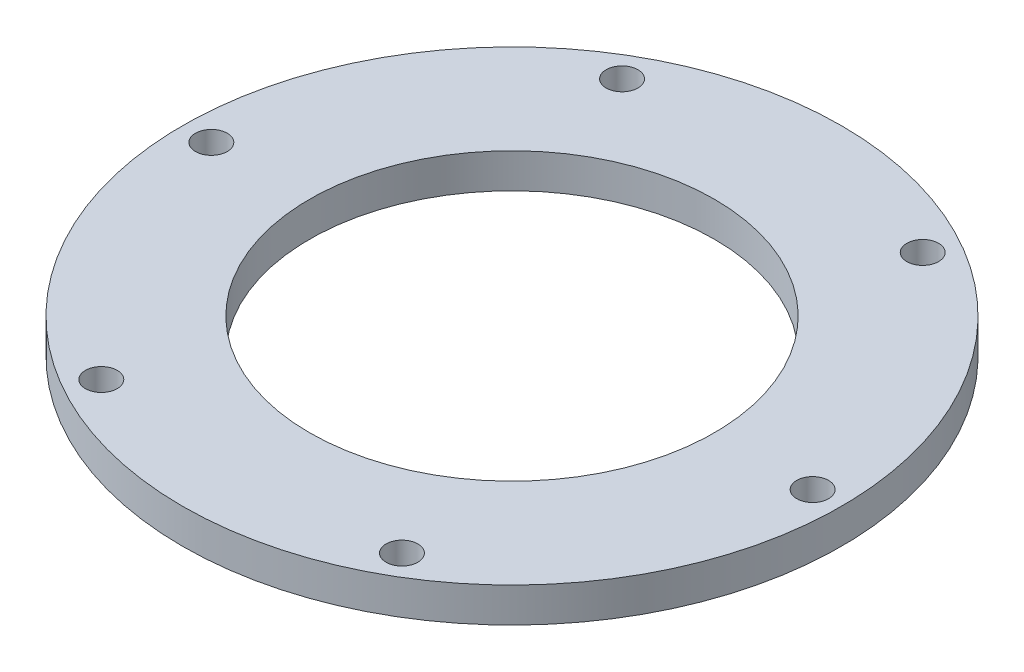
ISO-10303-21;
HEADER;
FILE_DESCRIPTION(('STEP AP214'),'2;1');
FILE_NAME('part.step','',(''),(''),'','','');
FILE_SCHEMA(('AUTOMOTIVE_DESIGN { 1 0 10303 214 1 1 1 1 }'));
ENDSEC;
DATA;
#1=APPLICATION_CONTEXT('core data for automotive mechanical design processes');
#2=APPLICATION_PROTOCOL_DEFINITION('international standard','automotive_design',2000,#1);
#3=PRODUCT_CONTEXT('',#1,'mechanical');
#4=PRODUCT('Part','Part','',(#3));
#5=PRODUCT_RELATED_PRODUCT_CATEGORY('part','',(#4));
#6=PRODUCT_DEFINITION_FORMATION('','',#4);
#7=PRODUCT_DEFINITION_CONTEXT('part definition',#1,'design');
#8=PRODUCT_DEFINITION('design','',#6,#7);
#9=PRODUCT_DEFINITION_SHAPE('','',#8);
#10=(LENGTH_UNIT() NAMED_UNIT(*) SI_UNIT(.MILLI.,.METRE.));
#11=(NAMED_UNIT(*) PLANE_ANGLE_UNIT() SI_UNIT($,.RADIAN.));
#12=(NAMED_UNIT(*) SI_UNIT($,.STERADIAN.) SOLID_ANGLE_UNIT());
#13=UNCERTAINTY_MEASURE_WITH_UNIT(LENGTH_MEASURE(1.E-05),#10,'distance_accuracy_value','');
#14=(GEOMETRIC_REPRESENTATION_CONTEXT(3) GLOBAL_UNCERTAINTY_ASSIGNED_CONTEXT((#13)) GLOBAL_UNIT_ASSIGNED_CONTEXT((#10,
#11,#12)) REPRESENTATION_CONTEXT('',''));
#15=CARTESIAN_POINT('',(0.,0.,0.));
#16=DIRECTION('',(0.,0.,1.));
#17=DIRECTION('',(1.,0.,0.));
#18=AXIS2_PLACEMENT_3D('',#15,#16,#17);
#19=CARTESIAN_POINT('',(26.,-146.5,150.03332099679));
#20=DIRECTION('',(0.,1.,0.));
#21=DIRECTION('',(0.,0.,1.));
#22=AXIS2_PLACEMENT_3D('',#19,#20,#21);
#23=CYLINDRICAL_SURFACE('',#22,2.75);
#24=DIRECTION('',(0.,1.,0.));
#25=VECTOR('',#24,1.);
#26=CARTESIAN_POINT('',(26.,-146.5,152.78332099679));
#27=LINE('',#26,#25);
#28=CARTESIAN_POINT('',(26.,-146.,152.78332099679));
#29=VERTEX_POINT('',#28);
#30=CARTESIAN_POINT('',(26.,-140.,152.78332099679));
#31=VERTEX_POINT('',#30);
#32=EDGE_CURVE('E10',#29,#31,#27,.T.);
#33=ORIENTED_EDGE('',*,*,#32,.F.);
#34=CARTESIAN_POINT('',(26.,-146.,150.03332099679));
#35=DIRECTION('',(0.,1.,0.));
#36=DIRECTION('',(0.,0.,1.));
#37=AXIS2_PLACEMENT_3D('',#34,#35,#36);
#38=CIRCLE('',#37,2.75);
#39=EDGE_CURVE('E115',#29,#29,#38,.T.);
#40=ORIENTED_EDGE('',*,*,#39,.F.);
#41=ORIENTED_EDGE('',*,*,#32,.T.);
#42=CARTESIAN_POINT('',(26.,-140.,150.03332099679));
#43=DIRECTION('',(0.,1.,0.));
#44=DIRECTION('',(0.,0.,1.));
#45=AXIS2_PLACEMENT_3D('',#42,#43,#44);
#46=CIRCLE('',#45,2.75);
#47=EDGE_CURVE('E121',#31,#31,#46,.T.);
#48=ORIENTED_EDGE('',*,*,#47,.T.);
#49=EDGE_LOOP('',(#33,#40,#41,#48));
#50=FACE_BOUND('',#49,.T.);
#51=ADVANCED_FACE('F16',(#50),#23,.F.);
#52=CARTESIAN_POINT('',(52.,-146.5,105.));
#53=DIRECTION('',(0.,1.,0.));
#54=DIRECTION('',(0.,0.,1.));
#55=AXIS2_PLACEMENT_3D('',#52,#53,#54);
#56=CYLINDRICAL_SURFACE('',#55,2.75);
#57=DIRECTION('',(0.,1.,0.));
#58=VECTOR('',#57,1.);
#59=CARTESIAN_POINT('',(52.,-146.5,107.75));
#60=LINE('',#59,#58);
#61=CARTESIAN_POINT('',(52.,-146.,107.75));
#62=VERTEX_POINT('',#61);
#63=CARTESIAN_POINT('',(52.,-140.,107.75));
#64=VERTEX_POINT('',#63);
#65=EDGE_CURVE('E27',#62,#64,#60,.T.);
#66=ORIENTED_EDGE('',*,*,#65,.F.);
#67=CARTESIAN_POINT('',(52.,-146.,105.));
#68=DIRECTION('',(0.,1.,0.));
#69=DIRECTION('',(0.,0.,1.));
#70=AXIS2_PLACEMENT_3D('',#67,#68,#69);
#71=CIRCLE('',#70,2.75);
#72=EDGE_CURVE('E136',#62,#62,#71,.T.);
#73=ORIENTED_EDGE('',*,*,#72,.F.);
#74=ORIENTED_EDGE('',*,*,#65,.T.);
#75=CARTESIAN_POINT('',(52.,-140.,105.));
#76=DIRECTION('',(0.,1.,0.));
#77=DIRECTION('',(0.,0.,1.));
#78=AXIS2_PLACEMENT_3D('',#75,#76,#77);
#79=CIRCLE('',#78,2.75);
#80=EDGE_CURVE('E131',#64,#64,#79,.T.);
#81=ORIENTED_EDGE('',*,*,#80,.T.);
#82=EDGE_LOOP('',(#66,#73,#74,#81));
#83=FACE_BOUND('',#82,.T.);
#84=ADVANCED_FACE('F18',(#83),#56,.F.);
#85=CARTESIAN_POINT('',(0.,-146.,105.));
#86=DIRECTION('',(0.,1.,0.));
#87=DIRECTION('',(0.,0.,1.));
#88=AXIS2_PLACEMENT_3D('',#85,#86,#87);
#89=CYLINDRICAL_SURFACE('',#88,35.);
#90=DIRECTION('',(0.,1.,0.));
#91=VECTOR('',#90,1.);
#92=CARTESIAN_POINT('',(0.,-146.,140.));
#93=LINE('',#92,#91);
#94=CARTESIAN_POINT('',(0.,-146.,140.));
#95=VERTEX_POINT('',#94);
#96=CARTESIAN_POINT('',(0.,-140.,140.));
#97=VERTEX_POINT('',#96);
#98=EDGE_CURVE('E148',#95,#97,#93,.T.);
#99=ORIENTED_EDGE('',*,*,#98,.F.);
#100=CARTESIAN_POINT('',(0.,-146.,105.));
#101=DIRECTION('',(0.,1.,0.));
#102=DIRECTION('',(0.,0.,1.));
#103=AXIS2_PLACEMENT_3D('',#100,#101,#102);
#104=CIRCLE('',#103,35.);
#105=EDGE_CURVE('E139',#95,#95,#104,.T.);
#106=ORIENTED_EDGE('',*,*,#105,.F.);
#107=ORIENTED_EDGE('',*,*,#98,.T.);
#108=CARTESIAN_POINT('',(0.,-140.,105.));
#109=DIRECTION('',(0.,1.,0.));
#110=DIRECTION('',(0.,0.,1.));
#111=AXIS2_PLACEMENT_3D('',#108,#109,#110);
#112=CIRCLE('',#111,35.);
#113=EDGE_CURVE('E167',#97,#97,#112,.T.);
#114=ORIENTED_EDGE('',*,*,#113,.T.);
#115=EDGE_LOOP('',(#99,#106,#107,#114));
#116=FACE_BOUND('',#115,.T.);
#117=ADVANCED_FACE('F221',(#116),#89,.F.);
#118=CARTESIAN_POINT('',(26.,-146.5,59.966679003209));
#119=DIRECTION('',(0.,1.,0.));
#120=DIRECTION('',(0.,0.,1.));
#121=AXIS2_PLACEMENT_3D('',#118,#119,#120);
#122=CYLINDRICAL_SURFACE('',#121,2.75);
#123=DIRECTION('',(0.,1.,0.));
#124=VECTOR('',#123,1.);
#125=CARTESIAN_POINT('',(26.,-146.5,62.716679003209));
#126=LINE('',#125,#124);
#127=CARTESIAN_POINT('',(26.,-146.,62.716679003209));
#128=VERTEX_POINT('',#127);
#129=CARTESIAN_POINT('',(26.,-140.,62.716679003209));
#130=VERTEX_POINT('',#129);
#131=EDGE_CURVE('E73',#128,#130,#126,.T.);
#132=ORIENTED_EDGE('',*,*,#131,.F.);
#133=CARTESIAN_POINT('',(26.,-146.,59.966679003209));
#134=DIRECTION('',(0.,1.,0.));
#135=DIRECTION('',(0.,0.,1.));
#136=AXIS2_PLACEMENT_3D('',#133,#134,#135);
#137=CIRCLE('',#136,2.75);
#138=EDGE_CURVE('E144',#128,#128,#137,.T.);
#139=ORIENTED_EDGE('',*,*,#138,.F.);
#140=ORIENTED_EDGE('',*,*,#131,.T.);
#141=CARTESIAN_POINT('',(26.,-140.,59.966679003209));
#142=DIRECTION('',(0.,1.,0.));
#143=DIRECTION('',(0.,0.,1.));
#144=AXIS2_PLACEMENT_3D('',#141,#142,#143);
#145=CIRCLE('',#144,2.75);
#146=EDGE_CURVE('E160',#130,#130,#145,.T.);
#147=ORIENTED_EDGE('',*,*,#146,.T.);
#148=EDGE_LOOP('',(#132,#139,#140,#147));
#149=FACE_BOUND('',#148,.T.);
#150=ADVANCED_FACE('F223',(#149),#122,.F.);
#151=CARTESIAN_POINT('',(-26.,-146.5,150.03332099679));
#152=DIRECTION('',(0.,1.,0.));
#153=DIRECTION('',(0.,0.,1.));
#154=AXIS2_PLACEMENT_3D('',#151,#152,#153);
#155=CYLINDRICAL_SURFACE('',#154,2.75);
#156=DIRECTION('',(0.,1.,0.));
#157=VECTOR('',#156,1.);
#158=CARTESIAN_POINT('',(-26.,-146.5,152.78332099679));
#159=LINE('',#158,#157);
#160=CARTESIAN_POINT('',(-26.,-146.,152.78332099679));
#161=VERTEX_POINT('',#160);
#162=CARTESIAN_POINT('',(-26.,-140.,152.78332099679));
#163=VERTEX_POINT('',#162);
#164=EDGE_CURVE('E85',#161,#163,#159,.T.);
#165=ORIENTED_EDGE('',*,*,#164,.F.);
#166=CARTESIAN_POINT('',(-26.,-146.,150.03332099679));
#167=DIRECTION('',(0.,1.,0.));
#168=DIRECTION('',(0.,0.,1.));
#169=AXIS2_PLACEMENT_3D('',#166,#167,#168);
#170=CIRCLE('',#169,2.75);
#171=EDGE_CURVE('E128',#161,#161,#170,.T.);
#172=ORIENTED_EDGE('',*,*,#171,.F.);
#173=ORIENTED_EDGE('',*,*,#164,.T.);
#174=CARTESIAN_POINT('',(-26.,-140.,150.03332099679));
#175=DIRECTION('',(0.,1.,0.));
#176=DIRECTION('',(0.,0.,1.));
#177=AXIS2_PLACEMENT_3D('',#174,#175,#176);
#178=CIRCLE('',#177,2.75);
#179=EDGE_CURVE('E155',#163,#163,#178,.T.);
#180=ORIENTED_EDGE('',*,*,#179,.T.);
#181=EDGE_LOOP('',(#165,#172,#173,#180));
#182=FACE_BOUND('',#181,.T.);
#183=ADVANCED_FACE('F230',(#182),#155,.F.);
#184=CARTESIAN_POINT('',(-26.,-146.5,59.966679003209));
#185=DIRECTION('',(0.,1.,0.));
#186=DIRECTION('',(0.,0.,1.));
#187=AXIS2_PLACEMENT_3D('',#184,#185,#186);
#188=CYLINDRICAL_SURFACE('',#187,2.75);
#189=DIRECTION('',(0.,1.,0.));
#190=VECTOR('',#189,1.);
#191=CARTESIAN_POINT('',(-26.,-146.5,62.716679003209));
#192=LINE('',#191,#190);
#193=CARTESIAN_POINT('',(-26.,-146.,62.716679003209));
#194=VERTEX_POINT('',#193);
#195=CARTESIAN_POINT('',(-26.,-140.,62.716679003209));
#196=VERTEX_POINT('',#195);
#197=EDGE_CURVE('E114',#194,#196,#192,.T.);
#198=ORIENTED_EDGE('',*,*,#197,.F.);
#199=CARTESIAN_POINT('',(-26.,-146.,59.966679003209));
#200=DIRECTION('',(0.,1.,0.));
#201=DIRECTION('',(0.,0.,1.));
#202=AXIS2_PLACEMENT_3D('',#199,#200,#201);
#203=CIRCLE('',#202,2.75);
#204=EDGE_CURVE('E120',#194,#194,#203,.T.);
#205=ORIENTED_EDGE('',*,*,#204,.F.);
#206=ORIENTED_EDGE('',*,*,#197,.T.);
#207=CARTESIAN_POINT('',(-26.,-140.,59.966679003209));
#208=DIRECTION('',(0.,1.,0.));
#209=DIRECTION('',(0.,0.,1.));
#210=AXIS2_PLACEMENT_3D('',#207,#208,#209);
#211=CIRCLE('',#210,2.75);
#212=EDGE_CURVE('E151',#196,#196,#211,.T.);
#213=ORIENTED_EDGE('',*,*,#212,.T.);
#214=EDGE_LOOP('',(#198,#205,#206,#213));
#215=FACE_BOUND('',#214,.T.);
#216=ADVANCED_FACE('F239',(#215),#188,.F.);
#217=CARTESIAN_POINT('',(-52.,-146.5,105.));
#218=DIRECTION('',(0.,1.,0.));
#219=DIRECTION('',(0.,0.,1.));
#220=AXIS2_PLACEMENT_3D('',#217,#218,#219);
#221=CYLINDRICAL_SURFACE('',#220,2.75);
#222=DIRECTION('',(0.,1.,0.));
#223=VECTOR('',#222,1.);
#224=CARTESIAN_POINT('',(-52.,-146.5,107.75));
#225=LINE('',#224,#223);
#226=CARTESIAN_POINT('',(-52.,-146.,107.75));
#227=VERTEX_POINT('',#226);
#228=CARTESIAN_POINT('',(-52.,-140.,107.75));
#229=VERTEX_POINT('',#228);
#230=EDGE_CURVE('E20',#227,#229,#225,.T.);
#231=ORIENTED_EDGE('',*,*,#230,.F.);
#232=CARTESIAN_POINT('',(-52.,-146.,105.));
#233=DIRECTION('',(0.,1.,0.));
#234=DIRECTION('',(0.,0.,1.));
#235=AXIS2_PLACEMENT_3D('',#232,#233,#234);
#236=CIRCLE('',#235,2.75);
#237=EDGE_CURVE('E110',#227,#227,#236,.T.);
#238=ORIENTED_EDGE('',*,*,#237,.F.);
#239=ORIENTED_EDGE('',*,*,#230,.T.);
#240=CARTESIAN_POINT('',(-52.,-140.,105.));
#241=DIRECTION('',(0.,1.,0.));
#242=DIRECTION('',(0.,0.,1.));
#243=AXIS2_PLACEMENT_3D('',#240,#241,#242);
#244=CIRCLE('',#243,2.75);
#245=EDGE_CURVE('E112',#229,#229,#244,.T.);
#246=ORIENTED_EDGE('',*,*,#245,.T.);
#247=EDGE_LOOP('',(#231,#238,#239,#246));
#248=FACE_BOUND('',#247,.T.);
#249=ADVANCED_FACE('F109',(#248),#221,.F.);
#250=CARTESIAN_POINT('',(0.,-146.,105.));
#251=DIRECTION('',(0.,1.,0.));
#252=DIRECTION('',(1.,0.,0.));
#253=AXIS2_PLACEMENT_3D('',#250,#251,#252);
#254=PLANE('',#253);
#255=ORIENTED_EDGE('',*,*,#39,.T.);
#256=EDGE_LOOP('',(#255));
#257=FACE_BOUND('',#256,.T.);
#258=ORIENTED_EDGE('',*,*,#72,.T.);
#259=EDGE_LOOP('',(#258));
#260=FACE_BOUND('',#259,.T.);
#261=ORIENTED_EDGE('',*,*,#105,.T.);
#262=EDGE_LOOP('',(#261));
#263=FACE_BOUND('',#262,.T.);
#264=ORIENTED_EDGE('',*,*,#138,.T.);
#265=EDGE_LOOP('',(#264));
#266=FACE_BOUND('',#265,.T.);
#267=ORIENTED_EDGE('',*,*,#171,.T.);
#268=EDGE_LOOP('',(#267));
#269=FACE_BOUND('',#268,.T.);
#270=ORIENTED_EDGE('',*,*,#204,.T.);
#271=EDGE_LOOP('',(#270));
#272=FACE_BOUND('',#271,.T.);
#273=ORIENTED_EDGE('',*,*,#237,.T.);
#274=EDGE_LOOP('',(#273));
#275=FACE_BOUND('',#274,.T.);
#276=CARTESIAN_POINT('',(0.,-146.,105.));
#277=DIRECTION('',(0.,1.,0.));
#278=DIRECTION('',(0.,0.,1.));
#279=AXIS2_PLACEMENT_3D('',#276,#277,#278);
#280=CIRCLE('',#279,57.);
#281=CARTESIAN_POINT('',(0.,-146.,162.));
#282=VERTEX_POINT('',#281);
#283=EDGE_CURVE('E152',#282,#282,#280,.T.);
#284=ORIENTED_EDGE('',*,*,#283,.F.);
#285=EDGE_LOOP('',(#284));
#286=FACE_BOUND('',#285,.T.);
#287=ADVANCED_FACE('F117',(#257,#260,#263,#266,#269,#272,#275,#286),#254,.F.);
#288=CARTESIAN_POINT('',(0.,-140.,105.));
#289=DIRECTION('',(0.,1.,0.));
#290=DIRECTION('',(1.,0.,0.));
#291=AXIS2_PLACEMENT_3D('',#288,#289,#290);
#292=PLANE('',#291);
#293=ORIENTED_EDGE('',*,*,#47,.F.);
#294=EDGE_LOOP('',(#293));
#295=FACE_BOUND('',#294,.T.);
#296=ORIENTED_EDGE('',*,*,#80,.F.);
#297=EDGE_LOOP('',(#296));
#298=FACE_BOUND('',#297,.T.);
#299=ORIENTED_EDGE('',*,*,#113,.F.);
#300=EDGE_LOOP('',(#299));
#301=FACE_BOUND('',#300,.T.);
#302=ORIENTED_EDGE('',*,*,#146,.F.);
#303=EDGE_LOOP('',(#302));
#304=FACE_BOUND('',#303,.T.);
#305=ORIENTED_EDGE('',*,*,#179,.F.);
#306=EDGE_LOOP('',(#305));
#307=FACE_BOUND('',#306,.T.);
#308=ORIENTED_EDGE('',*,*,#212,.F.);
#309=EDGE_LOOP('',(#308));
#310=FACE_BOUND('',#309,.T.);
#311=ORIENTED_EDGE('',*,*,#245,.F.);
#312=EDGE_LOOP('',(#311));
#313=FACE_BOUND('',#312,.T.);
#314=CARTESIAN_POINT('',(0.,-140.,105.));
#315=DIRECTION('',(0.,1.,0.));
#316=DIRECTION('',(0.,0.,1.));
#317=AXIS2_PLACEMENT_3D('',#314,#315,#316);
#318=CIRCLE('',#317,57.);
#319=CARTESIAN_POINT('',(0.,-140.,162.));
#320=VERTEX_POINT('',#319);
#321=EDGE_CURVE('E134',#320,#320,#318,.T.);
#322=ORIENTED_EDGE('',*,*,#321,.T.);
#323=EDGE_LOOP('',(#322));
#324=FACE_BOUND('',#323,.T.);
#325=ADVANCED_FACE('F179',(#295,#298,#301,#304,#307,#310,#313,#324),#292,.T.);
#326=CARTESIAN_POINT('',(0.,-146.,105.));
#327=DIRECTION('',(0.,1.,0.));
#328=DIRECTION('',(0.,0.,1.));
#329=AXIS2_PLACEMENT_3D('',#326,#327,#328);
#330=CYLINDRICAL_SURFACE('',#329,57.);
#331=ORIENTED_EDGE('',*,*,#321,.F.);
#332=DIRECTION('',(0.,1.,0.));
#333=VECTOR('',#332,1.);
#334=CARTESIAN_POINT('',(0.,-146.,162.));
#335=LINE('',#334,#333);
#336=EDGE_CURVE('E198',#282,#320,#335,.T.);
#337=ORIENTED_EDGE('',*,*,#336,.F.);
#338=ORIENTED_EDGE('',*,*,#283,.T.);
#339=ORIENTED_EDGE('',*,*,#336,.T.);
#340=EDGE_LOOP('',(#331,#337,#338,#339));
#341=FACE_BOUND('',#340,.T.);
#342=ADVANCED_FACE('F182',(#341),#330,.T.);
#343=CLOSED_SHELL('',(#51,#84,#117,#150,#183,#216,#249,#287,#325,#342));
#344=MANIFOLD_SOLID_BREP('B1',#343);
#345=ADVANCED_BREP_SHAPE_REPRESENTATION('',(#18,#344),#14);
#346=SHAPE_DEFINITION_REPRESENTATION(#9,#345);
ENDSEC;
END-ISO-10303-21;
